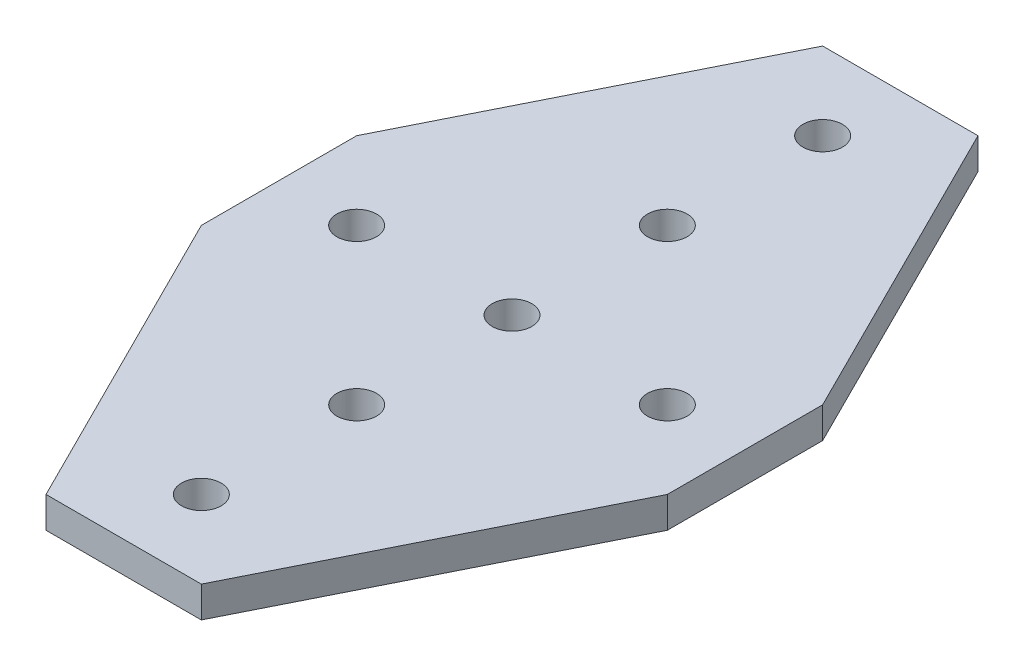
ISO-10303-21;
HEADER;
FILE_DESCRIPTION(('STEP AP214'),'2;1');
FILE_NAME('part.step','',(''),(''),'','','');
FILE_SCHEMA(('AUTOMOTIVE_DESIGN { 1 0 10303 214 1 1 1 1 }'));
ENDSEC;
DATA;
#1=APPLICATION_CONTEXT('core data for automotive mechanical design processes');
#2=APPLICATION_PROTOCOL_DEFINITION('international standard','automotive_design',2000,#1);
#3=PRODUCT_CONTEXT('',#1,'mechanical');
#4=PRODUCT('Part','Part','',(#3));
#5=PRODUCT_RELATED_PRODUCT_CATEGORY('part','',(#4));
#6=PRODUCT_DEFINITION_FORMATION('','',#4);
#7=PRODUCT_DEFINITION_CONTEXT('part definition',#1,'design');
#8=PRODUCT_DEFINITION('design','',#6,#7);
#9=PRODUCT_DEFINITION_SHAPE('','',#8);
#10=(LENGTH_UNIT() NAMED_UNIT(*) SI_UNIT(.MILLI.,.METRE.));
#11=(NAMED_UNIT(*) PLANE_ANGLE_UNIT() SI_UNIT($,.RADIAN.));
#12=(NAMED_UNIT(*) SI_UNIT($,.STERADIAN.) SOLID_ANGLE_UNIT());
#13=UNCERTAINTY_MEASURE_WITH_UNIT(LENGTH_MEASURE(1.E-05),#10,'distance_accuracy_value','');
#14=(GEOMETRIC_REPRESENTATION_CONTEXT(3) GLOBAL_UNCERTAINTY_ASSIGNED_CONTEXT((#13)) GLOBAL_UNIT_ASSIGNED_CONTEXT((#10,
#11,#12)) REPRESENTATION_CONTEXT('',''));
#15=CARTESIAN_POINT('',(0.,0.,0.));
#16=DIRECTION('',(0.,0.,1.));
#17=DIRECTION('',(1.,0.,0.));
#18=AXIS2_PLACEMENT_3D('',#15,#16,#17);
#19=CARTESIAN_POINT('',(0.,4.,0.));
#20=DIRECTION('',(0.,-1.,0.));
#21=DIRECTION('',(0.,0.,-1.));
#22=AXIS2_PLACEMENT_3D('',#19,#20,#21);
#23=PLANE('',#22);
#24=CARTESIAN_POINT('',(-20.,4.,0.));
#25=DIRECTION('',(0.,1.,0.));
#26=DIRECTION('',(0.,0.,1.));
#27=AXIS2_PLACEMENT_3D('',#24,#25,#26);
#28=CIRCLE('',#27,2.55);
#29=CARTESIAN_POINT('',(-20.,4.,2.55));
#30=VERTEX_POINT('',#29);
#31=EDGE_CURVE('E207',#30,#30,#28,.T.);
#32=ORIENTED_EDGE('',*,*,#31,.F.);
#33=EDGE_LOOP('',(#32));
#34=FACE_BOUND('',#33,.T.);
#35=CARTESIAN_POINT('',(0.,4.,20.));
#36=DIRECTION('',(0.,1.,0.));
#37=DIRECTION('',(0.,0.,-1.));
#38=AXIS2_PLACEMENT_3D('',#35,#36,#37);
#39=CIRCLE('',#38,2.55);
#40=CARTESIAN_POINT('',(0.,4.,17.45));
#41=VERTEX_POINT('',#40);
#42=EDGE_CURVE('E195',#41,#41,#39,.T.);
#43=ORIENTED_EDGE('',*,*,#42,.F.);
#44=EDGE_LOOP('',(#43));
#45=FACE_BOUND('',#44,.T.);
#46=CARTESIAN_POINT('',(0.,4.,0.));
#47=DIRECTION('',(0.,1.,0.));
#48=DIRECTION('',(0.,0.,1.));
#49=AXIS2_PLACEMENT_3D('',#46,#47,#48);
#50=CIRCLE('',#49,2.55);
#51=CARTESIAN_POINT('',(0.,4.,2.55));
#52=VERTEX_POINT('',#51);
#53=EDGE_CURVE('E183',#52,#52,#50,.T.);
#54=ORIENTED_EDGE('',*,*,#53,.F.);
#55=EDGE_LOOP('',(#54));
#56=FACE_BOUND('',#55,.T.);
#57=DIRECTION('',(0.,0.,-1.));
#58=VECTOR('',#57,1.);
#59=CARTESIAN_POINT('',(30.,4.,10.));
#60=LINE('',#59,#58);
#61=CARTESIAN_POINT('',(30.,4.,10.));
#62=VERTEX_POINT('',#61);
#63=CARTESIAN_POINT('',(30.,4.,-10.));
#64=VERTEX_POINT('',#63);
#65=EDGE_CURVE('E146',#62,#64,#60,.T.);
#66=ORIENTED_EDGE('',*,*,#65,.T.);
#67=DIRECTION('',(-0.447213595499958,0.,-0.894427190999916));
#68=VECTOR('',#67,1.);
#69=CARTESIAN_POINT('',(30.,4.,-10.));
#70=LINE('',#69,#68);
#71=CARTESIAN_POINT('',(10.,4.,-50.));
#72=VERTEX_POINT('',#71);
#73=EDGE_CURVE('E94',#64,#72,#70,.T.);
#74=ORIENTED_EDGE('',*,*,#73,.T.);
#75=DIRECTION('',(-1.,0.,0.));
#76=VECTOR('',#75,1.);
#77=CARTESIAN_POINT('',(-10.,4.,-50.));
#78=LINE('',#77,#76);
#79=CARTESIAN_POINT('',(-10.,4.,-50.));
#80=VERTEX_POINT('',#79);
#81=EDGE_CURVE('E161',#72,#80,#78,.T.);
#82=ORIENTED_EDGE('',*,*,#81,.T.);
#83=DIRECTION('',(-0.447213595499958,0.,0.894427190999916));
#84=VECTOR('',#83,1.);
#85=CARTESIAN_POINT('',(-30.,4.,-10.));
#86=LINE('',#85,#84);
#87=CARTESIAN_POINT('',(-30.,4.,-10.));
#88=VERTEX_POINT('',#87);
#89=EDGE_CURVE('E174',#80,#88,#86,.T.);
#90=ORIENTED_EDGE('',*,*,#89,.T.);
#91=DIRECTION('',(0.,0.,1.));
#92=VECTOR('',#91,1.);
#93=CARTESIAN_POINT('',(-30.,4.,10.));
#94=LINE('',#93,#92);
#95=CARTESIAN_POINT('',(-30.,4.,10.));
#96=VERTEX_POINT('',#95);
#97=EDGE_CURVE('E113',#88,#96,#94,.T.);
#98=ORIENTED_EDGE('',*,*,#97,.T.);
#99=DIRECTION('',(0.447213595499958,0.,0.894427190999916));
#100=VECTOR('',#99,1.);
#101=CARTESIAN_POINT('',(-30.,4.,10.));
#102=LINE('',#101,#100);
#103=CARTESIAN_POINT('',(-10.,4.,50.));
#104=VERTEX_POINT('',#103);
#105=EDGE_CURVE('E107',#96,#104,#102,.T.);
#106=ORIENTED_EDGE('',*,*,#105,.T.);
#107=DIRECTION('',(1.,0.,0.));
#108=VECTOR('',#107,1.);
#109=CARTESIAN_POINT('',(-10.,4.,50.));
#110=LINE('',#109,#108);
#111=CARTESIAN_POINT('',(10.,4.,50.));
#112=VERTEX_POINT('',#111);
#113=EDGE_CURVE('E111',#104,#112,#110,.T.);
#114=ORIENTED_EDGE('',*,*,#113,.T.);
#115=DIRECTION('',(0.447213595499958,0.,-0.894427190999916));
#116=VECTOR('',#115,1.);
#117=CARTESIAN_POINT('',(30.,4.,10.));
#118=LINE('',#117,#116);
#119=EDGE_CURVE('E51',#112,#62,#118,.T.);
#120=ORIENTED_EDGE('',*,*,#119,.T.);
#121=EDGE_LOOP('',(#66,#74,#82,#90,#98,#106,#114,#120));
#122=FACE_BOUND('',#121,.T.);
#123=CARTESIAN_POINT('',(0.,4.,-20.));
#124=DIRECTION('',(0.,1.,0.));
#125=DIRECTION('',(0.,0.,1.));
#126=AXIS2_PLACEMENT_3D('',#123,#124,#125);
#127=CIRCLE('',#126,2.55);
#128=CARTESIAN_POINT('',(0.,4.,-17.45));
#129=VERTEX_POINT('',#128);
#130=EDGE_CURVE('E135',#129,#129,#127,.T.);
#131=ORIENTED_EDGE('',*,*,#130,.F.);
#132=EDGE_LOOP('',(#131));
#133=FACE_BOUND('',#132,.T.);
#134=CARTESIAN_POINT('',(0.,4.,-40.));
#135=DIRECTION('',(0.,1.,0.));
#136=DIRECTION('',(0.,0.,1.));
#137=AXIS2_PLACEMENT_3D('',#134,#135,#136);
#138=CIRCLE('',#137,2.55);
#139=CARTESIAN_POINT('',(0.,4.,-37.45));
#140=VERTEX_POINT('',#139);
#141=EDGE_CURVE('E189',#140,#140,#138,.T.);
#142=ORIENTED_EDGE('',*,*,#141,.F.);
#143=EDGE_LOOP('',(#142));
#144=FACE_BOUND('',#143,.T.);
#145=CARTESIAN_POINT('',(0.,4.,40.));
#146=DIRECTION('',(0.,1.,0.));
#147=DIRECTION('',(0.,0.,-1.));
#148=AXIS2_PLACEMENT_3D('',#145,#146,#147);
#149=CIRCLE('',#148,2.55);
#150=CARTESIAN_POINT('',(0.,4.,37.45));
#151=VERTEX_POINT('',#150);
#152=EDGE_CURVE('E201',#151,#151,#149,.T.);
#153=ORIENTED_EDGE('',*,*,#152,.F.);
#154=EDGE_LOOP('',(#153));
#155=FACE_BOUND('',#154,.T.);
#156=CARTESIAN_POINT('',(20.,4.,0.));
#157=DIRECTION('',(0.,1.,0.));
#158=DIRECTION('',(0.,0.,-1.));
#159=AXIS2_PLACEMENT_3D('',#156,#157,#158);
#160=CIRCLE('',#159,2.55);
#161=CARTESIAN_POINT('',(20.,4.,-2.55));
#162=VERTEX_POINT('',#161);
#163=EDGE_CURVE('E213',#162,#162,#160,.T.);
#164=ORIENTED_EDGE('',*,*,#163,.F.);
#165=EDGE_LOOP('',(#164));
#166=FACE_BOUND('',#165,.T.);
#167=ADVANCED_FACE('F34',(#34,#45,#56,#122,#133,#144,#155,#166),#23,.F.);
#168=CARTESIAN_POINT('',(0.,0.,0.));
#169=DIRECTION('',(0.,-1.,0.));
#170=DIRECTION('',(0.,0.,-1.));
#171=AXIS2_PLACEMENT_3D('',#168,#169,#170);
#172=PLANE('',#171);
#173=CARTESIAN_POINT('',(-20.,0.,0.));
#174=DIRECTION('',(0.,1.,0.));
#175=DIRECTION('',(0.,0.,1.));
#176=AXIS2_PLACEMENT_3D('',#173,#174,#175);
#177=CIRCLE('',#176,2.55);
#178=CARTESIAN_POINT('',(-20.,0.,2.55));
#179=VERTEX_POINT('',#178);
#180=EDGE_CURVE('E210',#179,#179,#177,.T.);
#181=ORIENTED_EDGE('',*,*,#180,.T.);
#182=EDGE_LOOP('',(#181));
#183=FACE_BOUND('',#182,.T.);
#184=CARTESIAN_POINT('',(0.,0.,20.));
#185=DIRECTION('',(0.,1.,0.));
#186=DIRECTION('',(0.,0.,-1.));
#187=AXIS2_PLACEMENT_3D('',#184,#185,#186);
#188=CIRCLE('',#187,2.55);
#189=CARTESIAN_POINT('',(0.,0.,17.45));
#190=VERTEX_POINT('',#189);
#191=EDGE_CURVE('E198',#190,#190,#188,.T.);
#192=ORIENTED_EDGE('',*,*,#191,.T.);
#193=EDGE_LOOP('',(#192));
#194=FACE_BOUND('',#193,.T.);
#195=CARTESIAN_POINT('',(0.,0.,0.));
#196=DIRECTION('',(0.,1.,0.));
#197=DIRECTION('',(0.,0.,1.));
#198=AXIS2_PLACEMENT_3D('',#195,#196,#197);
#199=CIRCLE('',#198,2.55);
#200=CARTESIAN_POINT('',(0.,0.,2.55));
#201=VERTEX_POINT('',#200);
#202=EDGE_CURVE('E186',#201,#201,#199,.T.);
#203=ORIENTED_EDGE('',*,*,#202,.T.);
#204=EDGE_LOOP('',(#203));
#205=FACE_BOUND('',#204,.T.);
#206=DIRECTION('',(0.,0.,-1.));
#207=VECTOR('',#206,1.);
#208=CARTESIAN_POINT('',(30.,0.,10.));
#209=LINE('',#208,#207);
#210=CARTESIAN_POINT('',(30.,0.,10.));
#211=VERTEX_POINT('',#210);
#212=CARTESIAN_POINT('',(30.,0.,-10.));
#213=VERTEX_POINT('',#212);
#214=EDGE_CURVE('E131',#211,#213,#209,.T.);
#215=ORIENTED_EDGE('',*,*,#214,.F.);
#216=DIRECTION('',(0.447213595499958,0.,-0.894427190999916));
#217=VECTOR('',#216,1.);
#218=CARTESIAN_POINT('',(30.,0.,10.));
#219=LINE('',#218,#217);
#220=CARTESIAN_POINT('',(10.,0.,50.));
#221=VERTEX_POINT('',#220);
#222=EDGE_CURVE('E86',#221,#211,#219,.T.);
#223=ORIENTED_EDGE('',*,*,#222,.F.);
#224=DIRECTION('',(1.,0.,0.));
#225=VECTOR('',#224,1.);
#226=CARTESIAN_POINT('',(-10.,0.,50.));
#227=LINE('',#226,#225);
#228=CARTESIAN_POINT('',(-10.,0.,50.));
#229=VERTEX_POINT('',#228);
#230=EDGE_CURVE('E80',#229,#221,#227,.T.);
#231=ORIENTED_EDGE('',*,*,#230,.F.);
#232=DIRECTION('',(0.447213595499958,0.,0.894427190999916));
#233=VECTOR('',#232,1.);
#234=CARTESIAN_POINT('',(-30.,0.,10.));
#235=LINE('',#234,#233);
#236=CARTESIAN_POINT('',(-30.,0.,10.));
#237=VERTEX_POINT('',#236);
#238=EDGE_CURVE('E121',#237,#229,#235,.T.);
#239=ORIENTED_EDGE('',*,*,#238,.F.);
#240=DIRECTION('',(0.,0.,1.));
#241=VECTOR('',#240,1.);
#242=CARTESIAN_POINT('',(-30.,0.,10.));
#243=LINE('',#242,#241);
#244=CARTESIAN_POINT('',(-30.,0.,-10.));
#245=VERTEX_POINT('',#244);
#246=EDGE_CURVE('E141',#245,#237,#243,.T.);
#247=ORIENTED_EDGE('',*,*,#246,.F.);
#248=DIRECTION('',(-0.447213595499958,0.,0.894427190999916));
#249=VECTOR('',#248,1.);
#250=CARTESIAN_POINT('',(-30.,0.,-10.));
#251=LINE('',#250,#249);
#252=CARTESIAN_POINT('',(-10.,0.,-50.));
#253=VERTEX_POINT('',#252);
#254=EDGE_CURVE('E139',#253,#245,#251,.T.);
#255=ORIENTED_EDGE('',*,*,#254,.F.);
#256=DIRECTION('',(-1.,0.,0.));
#257=VECTOR('',#256,1.);
#258=CARTESIAN_POINT('',(-10.,0.,-50.));
#259=LINE('',#258,#257);
#260=CARTESIAN_POINT('',(10.,0.,-50.));
#261=VERTEX_POINT('',#260);
#262=EDGE_CURVE('E137',#261,#253,#259,.T.);
#263=ORIENTED_EDGE('',*,*,#262,.F.);
#264=DIRECTION('',(-0.447213595499958,0.,-0.894427190999916));
#265=VECTOR('',#264,1.);
#266=CARTESIAN_POINT('',(30.,0.,-10.));
#267=LINE('',#266,#265);
#268=EDGE_CURVE('E134',#213,#261,#267,.T.);
#269=ORIENTED_EDGE('',*,*,#268,.F.);
#270=EDGE_LOOP('',(#215,#223,#231,#239,#247,#255,#263,#269));
#271=FACE_BOUND('',#270,.T.);
#272=CARTESIAN_POINT('',(0.,0.,-20.));
#273=DIRECTION('',(0.,1.,0.));
#274=DIRECTION('',(0.,0.,1.));
#275=AXIS2_PLACEMENT_3D('',#272,#273,#274);
#276=CIRCLE('',#275,2.55);
#277=CARTESIAN_POINT('',(0.,0.,-17.45));
#278=VERTEX_POINT('',#277);
#279=EDGE_CURVE('E180',#278,#278,#276,.T.);
#280=ORIENTED_EDGE('',*,*,#279,.T.);
#281=EDGE_LOOP('',(#280));
#282=FACE_BOUND('',#281,.T.);
#283=CARTESIAN_POINT('',(0.,0.,-40.));
#284=DIRECTION('',(0.,1.,0.));
#285=DIRECTION('',(0.,0.,1.));
#286=AXIS2_PLACEMENT_3D('',#283,#284,#285);
#287=CIRCLE('',#286,2.55);
#288=CARTESIAN_POINT('',(0.,0.,-37.45));
#289=VERTEX_POINT('',#288);
#290=EDGE_CURVE('E192',#289,#289,#287,.T.);
#291=ORIENTED_EDGE('',*,*,#290,.T.);
#292=EDGE_LOOP('',(#291));
#293=FACE_BOUND('',#292,.T.);
#294=CARTESIAN_POINT('',(0.,0.,40.));
#295=DIRECTION('',(0.,1.,0.));
#296=DIRECTION('',(0.,0.,-1.));
#297=AXIS2_PLACEMENT_3D('',#294,#295,#296);
#298=CIRCLE('',#297,2.55);
#299=CARTESIAN_POINT('',(0.,0.,37.45));
#300=VERTEX_POINT('',#299);
#301=EDGE_CURVE('E204',#300,#300,#298,.T.);
#302=ORIENTED_EDGE('',*,*,#301,.T.);
#303=EDGE_LOOP('',(#302));
#304=FACE_BOUND('',#303,.T.);
#305=CARTESIAN_POINT('',(20.,0.,0.));
#306=DIRECTION('',(0.,1.,0.));
#307=DIRECTION('',(0.,0.,-1.));
#308=AXIS2_PLACEMENT_3D('',#305,#306,#307);
#309=CIRCLE('',#308,2.55);
#310=CARTESIAN_POINT('',(20.,0.,-2.55));
#311=VERTEX_POINT('',#310);
#312=EDGE_CURVE('E216',#311,#311,#309,.T.);
#313=ORIENTED_EDGE('',*,*,#312,.T.);
#314=EDGE_LOOP('',(#313));
#315=FACE_BOUND('',#314,.T.);
#316=ADVANCED_FACE('F165',(#183,#194,#205,#271,#282,#293,#304,#315),#172,.T.);
#317=CARTESIAN_POINT('',(30.,4.,10.));
#318=DIRECTION('',(-1.,0.,0.));
#319=DIRECTION('',(0.,0.,1.));
#320=AXIS2_PLACEMENT_3D('',#317,#318,#319);
#321=PLANE('',#320);
#322=ORIENTED_EDGE('',*,*,#214,.T.);
#323=DIRECTION('',(0.,-1.,0.));
#324=VECTOR('',#323,1.);
#325=CARTESIAN_POINT('',(30.,4.,-10.));
#326=LINE('',#325,#324);
#327=EDGE_CURVE('E11',#64,#213,#326,.T.);
#328=ORIENTED_EDGE('',*,*,#327,.F.);
#329=ORIENTED_EDGE('',*,*,#65,.F.);
#330=DIRECTION('',(0.,-1.,0.));
#331=VECTOR('',#330,1.);
#332=CARTESIAN_POINT('',(30.,4.,10.));
#333=LINE('',#332,#331);
#334=EDGE_CURVE('E127',#62,#211,#333,.T.);
#335=ORIENTED_EDGE('',*,*,#334,.T.);
#336=EDGE_LOOP('',(#322,#328,#329,#335));
#337=FACE_BOUND('',#336,.T.);
#338=ADVANCED_FACE('F36',(#337),#321,.F.);
#339=CARTESIAN_POINT('',(30.,4.,-10.));
#340=DIRECTION('',(-0.894427190999916,0.,0.447213595499958));
#341=DIRECTION('',(0.447213595499958,0.,0.894427190999916));
#342=AXIS2_PLACEMENT_3D('',#339,#340,#341);
#343=PLANE('',#342);
#344=ORIENTED_EDGE('',*,*,#268,.T.);
#345=DIRECTION('',(0.,-1.,0.));
#346=VECTOR('',#345,1.);
#347=CARTESIAN_POINT('',(10.,4.,-50.));
#348=LINE('',#347,#346);
#349=EDGE_CURVE('E43',#72,#261,#348,.T.);
#350=ORIENTED_EDGE('',*,*,#349,.F.);
#351=ORIENTED_EDGE('',*,*,#73,.F.);
#352=ORIENTED_EDGE('',*,*,#327,.T.);
#353=EDGE_LOOP('',(#344,#350,#351,#352));
#354=FACE_BOUND('',#353,.T.);
#355=ADVANCED_FACE('F251',(#354),#343,.F.);
#356=CARTESIAN_POINT('',(-10.,4.,-50.));
#357=DIRECTION('',(0.,0.,1.));
#358=DIRECTION('',(1.,0.,0.));
#359=AXIS2_PLACEMENT_3D('',#356,#357,#358);
#360=PLANE('',#359);
#361=ORIENTED_EDGE('',*,*,#262,.T.);
#362=DIRECTION('',(0.,-1.,0.));
#363=VECTOR('',#362,1.);
#364=CARTESIAN_POINT('',(-10.,4.,-50.));
#365=LINE('',#364,#363);
#366=EDGE_CURVE('E153',#80,#253,#365,.T.);
#367=ORIENTED_EDGE('',*,*,#366,.F.);
#368=ORIENTED_EDGE('',*,*,#81,.F.);
#369=ORIENTED_EDGE('',*,*,#349,.T.);
#370=EDGE_LOOP('',(#361,#367,#368,#369));
#371=FACE_BOUND('',#370,.T.);
#372=ADVANCED_FACE('F159',(#371),#360,.F.);
#373=CARTESIAN_POINT('',(-30.,4.,-10.));
#374=DIRECTION('',(0.894427190999916,0.,0.447213595499958));
#375=DIRECTION('',(0.447213595499958,0.,-0.894427190999916));
#376=AXIS2_PLACEMENT_3D('',#373,#374,#375);
#377=PLANE('',#376);
#378=ORIENTED_EDGE('',*,*,#254,.T.);
#379=DIRECTION('',(0.,-1.,0.));
#380=VECTOR('',#379,1.);
#381=CARTESIAN_POINT('',(-30.,4.,-10.));
#382=LINE('',#381,#380);
#383=EDGE_CURVE('E150',#88,#245,#382,.T.);
#384=ORIENTED_EDGE('',*,*,#383,.F.);
#385=ORIENTED_EDGE('',*,*,#89,.F.);
#386=ORIENTED_EDGE('',*,*,#366,.T.);
#387=EDGE_LOOP('',(#378,#384,#385,#386));
#388=FACE_BOUND('',#387,.T.);
#389=ADVANCED_FACE('F170',(#388),#377,.F.);
#390=CARTESIAN_POINT('',(-30.,4.,10.));
#391=DIRECTION('',(1.,0.,0.));
#392=DIRECTION('',(0.,0.,-1.));
#393=AXIS2_PLACEMENT_3D('',#390,#391,#392);
#394=PLANE('',#393);
#395=ORIENTED_EDGE('',*,*,#246,.T.);
#396=DIRECTION('',(0.,-1.,0.));
#397=VECTOR('',#396,1.);
#398=CARTESIAN_POINT('',(-30.,4.,10.));
#399=LINE('',#398,#397);
#400=EDGE_CURVE('E122',#96,#237,#399,.T.);
#401=ORIENTED_EDGE('',*,*,#400,.F.);
#402=ORIENTED_EDGE('',*,*,#97,.F.);
#403=ORIENTED_EDGE('',*,*,#383,.T.);
#404=EDGE_LOOP('',(#395,#401,#402,#403));
#405=FACE_BOUND('',#404,.T.);
#406=ADVANCED_FACE('F173',(#405),#394,.F.);
#407=CARTESIAN_POINT('',(-30.,4.,10.));
#408=DIRECTION('',(0.894427190999916,0.,-0.447213595499958));
#409=DIRECTION('',(-0.447213595499958,0.,-0.894427190999916));
#410=AXIS2_PLACEMENT_3D('',#407,#408,#409);
#411=PLANE('',#410);
#412=ORIENTED_EDGE('',*,*,#238,.T.);
#413=DIRECTION('',(0.,-1.,0.));
#414=VECTOR('',#413,1.);
#415=CARTESIAN_POINT('',(-10.,4.,50.));
#416=LINE('',#415,#414);
#417=EDGE_CURVE('E118',#104,#229,#416,.T.);
#418=ORIENTED_EDGE('',*,*,#417,.F.);
#419=ORIENTED_EDGE('',*,*,#105,.F.);
#420=ORIENTED_EDGE('',*,*,#400,.T.);
#421=EDGE_LOOP('',(#412,#418,#419,#420));
#422=FACE_BOUND('',#421,.T.);
#423=ADVANCED_FACE('F119',(#422),#411,.F.);
#424=CARTESIAN_POINT('',(-10.,4.,50.));
#425=DIRECTION('',(0.,0.,-1.));
#426=DIRECTION('',(-1.,0.,0.));
#427=AXIS2_PLACEMENT_3D('',#424,#425,#426);
#428=PLANE('',#427);
#429=ORIENTED_EDGE('',*,*,#230,.T.);
#430=DIRECTION('',(0.,-1.,0.));
#431=VECTOR('',#430,1.);
#432=CARTESIAN_POINT('',(10.,4.,50.));
#433=LINE('',#432,#431);
#434=EDGE_CURVE('E123',#112,#221,#433,.T.);
#435=ORIENTED_EDGE('',*,*,#434,.F.);
#436=ORIENTED_EDGE('',*,*,#113,.F.);
#437=ORIENTED_EDGE('',*,*,#417,.T.);
#438=EDGE_LOOP('',(#429,#435,#436,#437));
#439=FACE_BOUND('',#438,.T.);
#440=ADVANCED_FACE('F125',(#439),#428,.F.);
#441=CARTESIAN_POINT('',(30.,4.,10.));
#442=DIRECTION('',(-0.894427190999916,0.,-0.447213595499958));
#443=DIRECTION('',(-0.447213595499958,0.,0.894427190999916));
#444=AXIS2_PLACEMENT_3D('',#441,#442,#443);
#445=PLANE('',#444);
#446=ORIENTED_EDGE('',*,*,#222,.T.);
#447=ORIENTED_EDGE('',*,*,#334,.F.);
#448=ORIENTED_EDGE('',*,*,#119,.F.);
#449=ORIENTED_EDGE('',*,*,#434,.T.);
#450=EDGE_LOOP('',(#446,#447,#448,#449));
#451=FACE_BOUND('',#450,.T.);
#452=ADVANCED_FACE('F239',(#451),#445,.F.);
#453=CARTESIAN_POINT('',(0.,4.,-20.));
#454=DIRECTION('',(0.,-1.,0.));
#455=DIRECTION('',(0.,0.,-1.));
#456=AXIS2_PLACEMENT_3D('',#453,#454,#455);
#457=CYLINDRICAL_SURFACE('',#456,2.55);
#458=ORIENTED_EDGE('',*,*,#130,.T.);
#459=EDGE_LOOP('',(#458));
#460=FACE_BOUND('',#459,.T.);
#461=ORIENTED_EDGE('',*,*,#279,.F.);
#462=EDGE_LOOP('',(#461));
#463=FACE_BOUND('',#462,.T.);
#464=ADVANCED_FACE('F236',(#460,#463),#457,.F.);
#465=CARTESIAN_POINT('',(0.,4.,0.));
#466=DIRECTION('',(0.,-1.,0.));
#467=DIRECTION('',(0.,0.,-1.));
#468=AXIS2_PLACEMENT_3D('',#465,#466,#467);
#469=CYLINDRICAL_SURFACE('',#468,2.55);
#470=ORIENTED_EDGE('',*,*,#53,.T.);
#471=EDGE_LOOP('',(#470));
#472=FACE_BOUND('',#471,.T.);
#473=ORIENTED_EDGE('',*,*,#202,.F.);
#474=EDGE_LOOP('',(#473));
#475=FACE_BOUND('',#474,.T.);
#476=ADVANCED_FACE('F315',(#472,#475),#469,.F.);
#477=CARTESIAN_POINT('',(0.,4.,-40.));
#478=DIRECTION('',(0.,-1.,0.));
#479=DIRECTION('',(0.,0.,-1.));
#480=AXIS2_PLACEMENT_3D('',#477,#478,#479);
#481=CYLINDRICAL_SURFACE('',#480,2.55);
#482=ORIENTED_EDGE('',*,*,#141,.T.);
#483=EDGE_LOOP('',(#482));
#484=FACE_BOUND('',#483,.T.);
#485=ORIENTED_EDGE('',*,*,#290,.F.);
#486=EDGE_LOOP('',(#485));
#487=FACE_BOUND('',#486,.T.);
#488=ADVANCED_FACE('F323',(#484,#487),#481,.F.);
#489=CARTESIAN_POINT('',(0.,4.,20.));
#490=DIRECTION('',(0.,-1.,0.));
#491=DIRECTION('',(0.,0.,-1.));
#492=AXIS2_PLACEMENT_3D('',#489,#490,#491);
#493=CYLINDRICAL_SURFACE('',#492,2.55);
#494=ORIENTED_EDGE('',*,*,#42,.T.);
#495=EDGE_LOOP('',(#494));
#496=FACE_BOUND('',#495,.T.);
#497=ORIENTED_EDGE('',*,*,#191,.F.);
#498=EDGE_LOOP('',(#497));
#499=FACE_BOUND('',#498,.T.);
#500=ADVANCED_FACE('F331',(#496,#499),#493,.F.);
#501=CARTESIAN_POINT('',(0.,4.,40.));
#502=DIRECTION('',(0.,-1.,0.));
#503=DIRECTION('',(0.,0.,-1.));
#504=AXIS2_PLACEMENT_3D('',#501,#502,#503);
#505=CYLINDRICAL_SURFACE('',#504,2.55);
#506=ORIENTED_EDGE('',*,*,#152,.T.);
#507=EDGE_LOOP('',(#506));
#508=FACE_BOUND('',#507,.T.);
#509=ORIENTED_EDGE('',*,*,#301,.F.);
#510=EDGE_LOOP('',(#509));
#511=FACE_BOUND('',#510,.T.);
#512=ADVANCED_FACE('F340',(#508,#511),#505,.F.);
#513=CARTESIAN_POINT('',(-20.,4.,0.));
#514=DIRECTION('',(0.,-1.,0.));
#515=DIRECTION('',(0.,0.,-1.));
#516=AXIS2_PLACEMENT_3D('',#513,#514,#515);
#517=CYLINDRICAL_SURFACE('',#516,2.55);
#518=ORIENTED_EDGE('',*,*,#31,.T.);
#519=EDGE_LOOP('',(#518));
#520=FACE_BOUND('',#519,.T.);
#521=ORIENTED_EDGE('',*,*,#180,.F.);
#522=EDGE_LOOP('',(#521));
#523=FACE_BOUND('',#522,.T.);
#524=ADVANCED_FACE('F349',(#520,#523),#517,.F.);
#525=CARTESIAN_POINT('',(20.,4.,0.));
#526=DIRECTION('',(0.,-1.,0.));
#527=DIRECTION('',(0.,0.,-1.));
#528=AXIS2_PLACEMENT_3D('',#525,#526,#527);
#529=CYLINDRICAL_SURFACE('',#528,2.55);
#530=ORIENTED_EDGE('',*,*,#163,.T.);
#531=EDGE_LOOP('',(#530));
#532=FACE_BOUND('',#531,.T.);
#533=ORIENTED_EDGE('',*,*,#312,.F.);
#534=EDGE_LOOP('',(#533));
#535=FACE_BOUND('',#534,.T.);
#536=ADVANCED_FACE('F222',(#532,#535),#529,.F.);
#537=CLOSED_SHELL('',(#167,#316,#338,#355,#372,#389,#406,#423,#440,#452,#464,#476,#488,#500,
#512,#524,#536));
#538=MANIFOLD_SOLID_BREP('B2',#537);
#539=ADVANCED_BREP_SHAPE_REPRESENTATION('',(#18,#538),#14);
#540=SHAPE_DEFINITION_REPRESENTATION(#9,#539);
ENDSEC;
END-ISO-10303-21;
